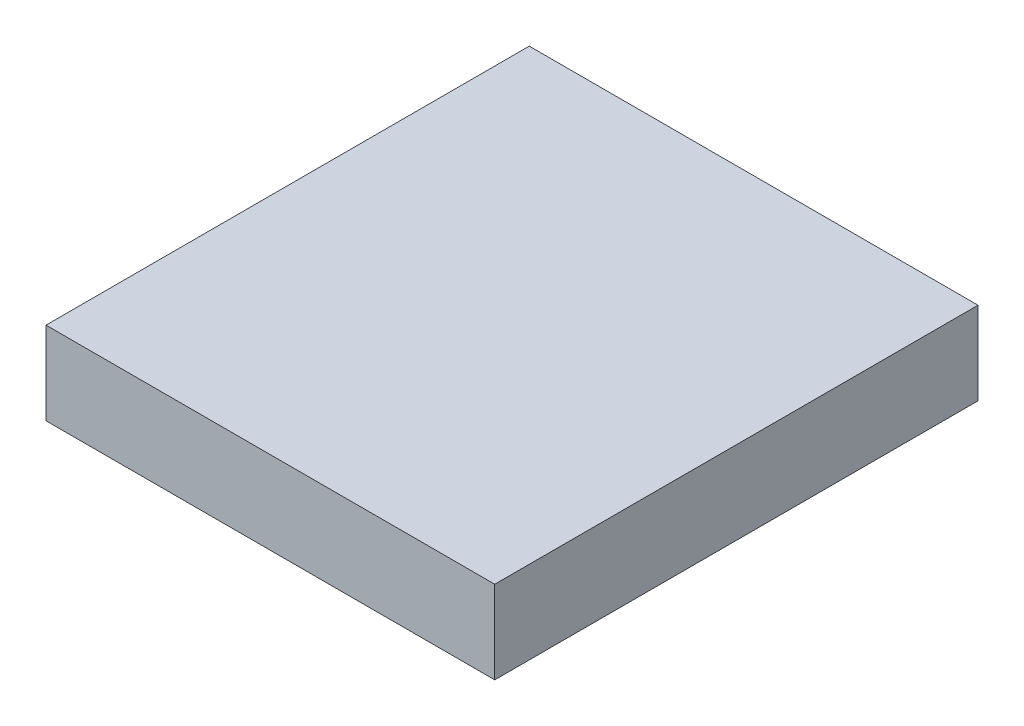
ISO-10303-21;
HEADER;
FILE_DESCRIPTION(('STEP AP214'),'2;1');
FILE_NAME('part.step','',(''),(''),'','','');
FILE_SCHEMA(('AUTOMOTIVE_DESIGN { 1 0 10303 214 1 1 1 1 }'));
ENDSEC;
DATA;
#1=APPLICATION_CONTEXT('core data for automotive mechanical design processes');
#2=APPLICATION_PROTOCOL_DEFINITION('international standard','automotive_design',2000,#1);
#3=PRODUCT_CONTEXT('',#1,'mechanical');
#4=PRODUCT('Part','Part','',(#3));
#5=PRODUCT_RELATED_PRODUCT_CATEGORY('part','',(#4));
#6=PRODUCT_DEFINITION_FORMATION('','',#4);
#7=PRODUCT_DEFINITION_CONTEXT('part definition',#1,'design');
#8=PRODUCT_DEFINITION('design','',#6,#7);
#9=PRODUCT_DEFINITION_SHAPE('','',#8);
#10=(LENGTH_UNIT() NAMED_UNIT(*) SI_UNIT(.MILLI.,.METRE.));
#11=(NAMED_UNIT(*) PLANE_ANGLE_UNIT() SI_UNIT($,.RADIAN.));
#12=(NAMED_UNIT(*) SI_UNIT($,.STERADIAN.) SOLID_ANGLE_UNIT());
#13=UNCERTAINTY_MEASURE_WITH_UNIT(LENGTH_MEASURE(1.E-05),#10,'distance_accuracy_value','');
#14=(GEOMETRIC_REPRESENTATION_CONTEXT(3) GLOBAL_UNCERTAINTY_ASSIGNED_CONTEXT((#13)) GLOBAL_UNIT_ASSIGNED_CONTEXT((#10,
#11,#12)) REPRESENTATION_CONTEXT('',''));
#15=CARTESIAN_POINT('',(0.,0.,0.));
#16=DIRECTION('',(0.,0.,1.));
#17=DIRECTION('',(1.,0.,0.));
#18=AXIS2_PLACEMENT_3D('',#15,#16,#17);
#19=CARTESIAN_POINT('',(0.,120.,0.));
#20=DIRECTION('',(1.,0.,0.));
#21=DIRECTION('',(0.,0.,-1.));
#22=AXIS2_PLACEMENT_3D('',#19,#20,#21);
#23=PLANE('',#22);
#24=DIRECTION('',(0.,0.,1.));
#25=VECTOR('',#24,1.);
#26=CARTESIAN_POINT('',(0.,0.,0.));
#27=LINE('',#26,#25);
#28=CARTESIAN_POINT('',(0.,0.,-700.));
#29=VERTEX_POINT('',#28);
#30=CARTESIAN_POINT('',(0.,0.,0.));
#31=VERTEX_POINT('',#30);
#32=EDGE_CURVE('E96',#29,#31,#27,.T.);
#33=ORIENTED_EDGE('',*,*,#32,.T.);
#34=DIRECTION('',(0.,-1.,0.));
#35=VECTOR('',#34,1.);
#36=CARTESIAN_POINT('',(0.,120.,0.));
#37=LINE('',#36,#35);
#38=CARTESIAN_POINT('',(0.,120.,0.));
#39=VERTEX_POINT('',#38);
#40=EDGE_CURVE('E11',#39,#31,#37,.T.);
#41=ORIENTED_EDGE('',*,*,#40,.F.);
#42=DIRECTION('',(0.,0.,1.));
#43=VECTOR('',#42,1.);
#44=CARTESIAN_POINT('',(0.,120.,0.));
#45=LINE('',#44,#43);
#46=CARTESIAN_POINT('',(0.,120.,-700.));
#47=VERTEX_POINT('',#46);
#48=EDGE_CURVE('E84',#47,#39,#45,.T.);
#49=ORIENTED_EDGE('',*,*,#48,.F.);
#50=DIRECTION('',(0.,-1.,0.));
#51=VECTOR('',#50,1.);
#52=CARTESIAN_POINT('',(0.,120.,-700.));
#53=LINE('',#52,#51);
#54=EDGE_CURVE('E92',#47,#29,#53,.T.);
#55=ORIENTED_EDGE('',*,*,#54,.T.);
#56=EDGE_LOOP('',(#33,#41,#49,#55));
#57=FACE_BOUND('',#56,.T.);
#58=ADVANCED_FACE('F33',(#57),#23,.F.);
#59=CARTESIAN_POINT('',(0.,120.,0.));
#60=DIRECTION('',(0.,0.,-1.));
#61=DIRECTION('',(-1.,0.,0.));
#62=AXIS2_PLACEMENT_3D('',#59,#60,#61);
#63=PLANE('',#62);
#64=DIRECTION('',(1.,0.,0.));
#65=VECTOR('',#64,1.);
#66=CARTESIAN_POINT('',(0.,0.,0.));
#67=LINE('',#66,#65);
#68=CARTESIAN_POINT('',(650.,0.,0.));
#69=VERTEX_POINT('',#68);
#70=EDGE_CURVE('E88',#31,#69,#67,.T.);
#71=ORIENTED_EDGE('',*,*,#70,.T.);
#72=DIRECTION('',(0.,-1.,0.));
#73=VECTOR('',#72,1.);
#74=CARTESIAN_POINT('',(650.,120.,0.));
#75=LINE('',#74,#73);
#76=CARTESIAN_POINT('',(650.,120.,0.));
#77=VERTEX_POINT('',#76);
#78=EDGE_CURVE('E41',#77,#69,#75,.T.);
#79=ORIENTED_EDGE('',*,*,#78,.F.);
#80=DIRECTION('',(1.,0.,0.));
#81=VECTOR('',#80,1.);
#82=CARTESIAN_POINT('',(0.,120.,0.));
#83=LINE('',#82,#81);
#84=EDGE_CURVE('E79',#39,#77,#83,.T.);
#85=ORIENTED_EDGE('',*,*,#84,.F.);
#86=ORIENTED_EDGE('',*,*,#40,.T.);
#87=EDGE_LOOP('',(#71,#79,#85,#86));
#88=FACE_BOUND('',#87,.T.);
#89=ADVANCED_FACE('F87',(#88),#63,.F.);
#90=CARTESIAN_POINT('',(650.,120.,0.));
#91=DIRECTION('',(-1.,0.,0.));
#92=DIRECTION('',(0.,0.,1.));
#93=AXIS2_PLACEMENT_3D('',#90,#91,#92);
#94=PLANE('',#93);
#95=DIRECTION('',(0.,0.,-1.));
#96=VECTOR('',#95,1.);
#97=CARTESIAN_POINT('',(650.,0.,0.));
#98=LINE('',#97,#96);
#99=CARTESIAN_POINT('',(650.,0.,-700.));
#100=VERTEX_POINT('',#99);
#101=EDGE_CURVE('E66',#69,#100,#98,.T.);
#102=ORIENTED_EDGE('',*,*,#101,.T.);
#103=DIRECTION('',(0.,-1.,0.));
#104=VECTOR('',#103,1.);
#105=CARTESIAN_POINT('',(650.,120.,-700.));
#106=LINE('',#105,#104);
#107=CARTESIAN_POINT('',(650.,120.,-700.));
#108=VERTEX_POINT('',#107);
#109=EDGE_CURVE('E89',#108,#100,#106,.T.);
#110=ORIENTED_EDGE('',*,*,#109,.F.);
#111=DIRECTION('',(0.,0.,-1.));
#112=VECTOR('',#111,1.);
#113=CARTESIAN_POINT('',(650.,120.,0.));
#114=LINE('',#113,#112);
#115=EDGE_CURVE('E82',#77,#108,#114,.T.);
#116=ORIENTED_EDGE('',*,*,#115,.F.);
#117=ORIENTED_EDGE('',*,*,#78,.T.);
#118=EDGE_LOOP('',(#102,#110,#116,#117));
#119=FACE_BOUND('',#118,.T.);
#120=ADVANCED_FACE('F90',(#119),#94,.F.);
#121=CARTESIAN_POINT('',(0.,120.,-700.));
#122=DIRECTION('',(0.,0.,1.));
#123=DIRECTION('',(1.,0.,0.));
#124=AXIS2_PLACEMENT_3D('',#121,#122,#123);
#125=PLANE('',#124);
#126=DIRECTION('',(-1.,0.,0.));
#127=VECTOR('',#126,1.);
#128=CARTESIAN_POINT('',(0.,0.,-700.));
#129=LINE('',#128,#127);
#130=EDGE_CURVE('E72',#100,#29,#129,.T.);
#131=ORIENTED_EDGE('',*,*,#130,.T.);
#132=ORIENTED_EDGE('',*,*,#54,.F.);
#133=DIRECTION('',(-1.,0.,0.));
#134=VECTOR('',#133,1.);
#135=CARTESIAN_POINT('',(0.,120.,-700.));
#136=LINE('',#135,#134);
#137=EDGE_CURVE('E49',#108,#47,#136,.T.);
#138=ORIENTED_EDGE('',*,*,#137,.F.);
#139=ORIENTED_EDGE('',*,*,#109,.T.);
#140=EDGE_LOOP('',(#131,#132,#138,#139));
#141=FACE_BOUND('',#140,.T.);
#142=ADVANCED_FACE('F103',(#141),#125,.F.);
#143=CARTESIAN_POINT('',(0.,120.,0.));
#144=DIRECTION('',(0.,-1.,0.));
#145=DIRECTION('',(0.,0.,-1.));
#146=AXIS2_PLACEMENT_3D('',#143,#144,#145);
#147=PLANE('',#146);
#148=ORIENTED_EDGE('',*,*,#48,.T.);
#149=ORIENTED_EDGE('',*,*,#84,.T.);
#150=ORIENTED_EDGE('',*,*,#115,.T.);
#151=ORIENTED_EDGE('',*,*,#137,.T.);
#152=EDGE_LOOP('',(#148,#149,#150,#151));
#153=FACE_BOUND('',#152,.T.);
#154=ADVANCED_FACE('F80',(#153),#147,.F.);
#155=CARTESIAN_POINT('',(0.,0.,0.));
#156=DIRECTION('',(0.,-1.,0.));
#157=DIRECTION('',(0.,0.,-1.));
#158=AXIS2_PLACEMENT_3D('',#155,#156,#157);
#159=PLANE('',#158);
#160=ORIENTED_EDGE('',*,*,#32,.F.);
#161=ORIENTED_EDGE('',*,*,#130,.F.);
#162=ORIENTED_EDGE('',*,*,#101,.F.);
#163=ORIENTED_EDGE('',*,*,#70,.F.);
#164=EDGE_LOOP('',(#160,#161,#162,#163));
#165=FACE_BOUND('',#164,.T.);
#166=ADVANCED_FACE('F106',(#165),#159,.T.);
#167=CLOSED_SHELL('',(#58,#89,#120,#142,#154,#166));
#168=MANIFOLD_SOLID_BREP('B2',#167);
#169=ADVANCED_BREP_SHAPE_REPRESENTATION('',(#18,#168),#14);
#170=SHAPE_DEFINITION_REPRESENTATION(#9,#169);
ENDSEC;
END-ISO-10303-21;
